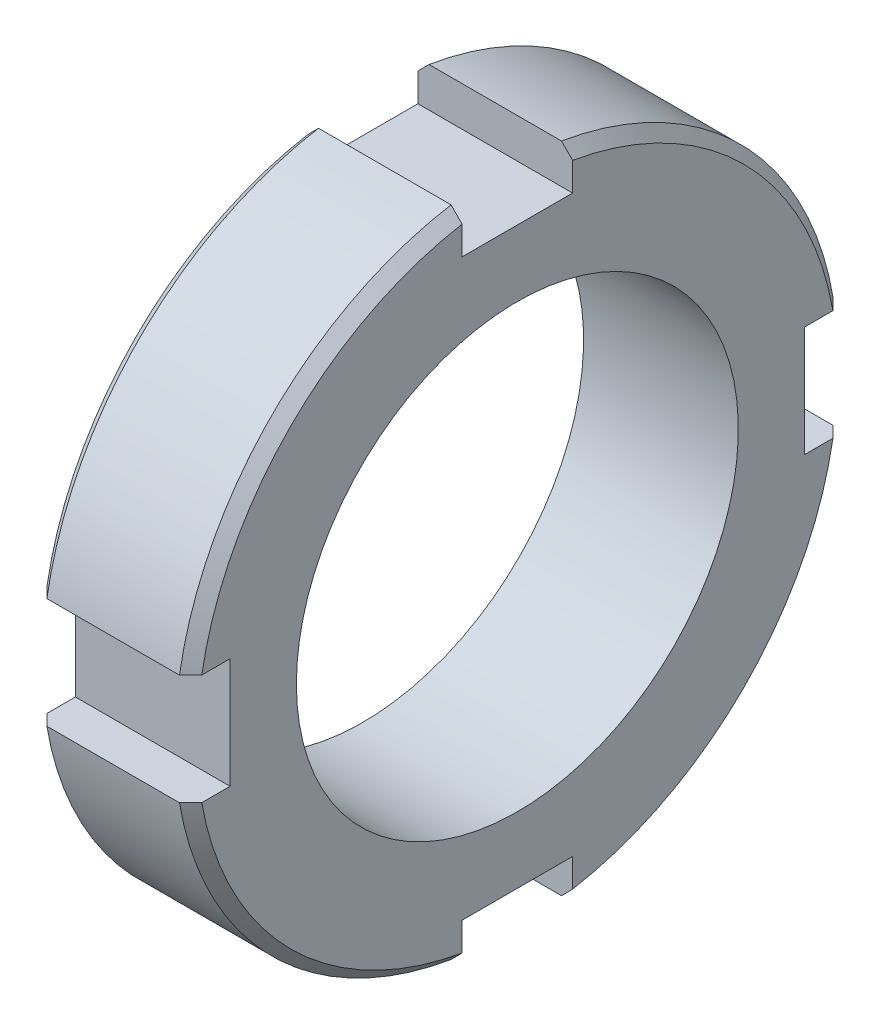
ISO-10303-21;
HEADER;
FILE_DESCRIPTION(('STEP AP214'),'2;1');
FILE_NAME('part.step','',(''),(''),'','','');
FILE_SCHEMA(('AUTOMOTIVE_DESIGN { 1 0 10303 214 1 1 1 1 }'));
ENDSEC;
DATA;
#1=APPLICATION_CONTEXT('core data for automotive mechanical design processes');
#2=APPLICATION_PROTOCOL_DEFINITION('international standard','automotive_design',2000,#1);
#3=PRODUCT_CONTEXT('',#1,'mechanical');
#4=PRODUCT('Part','Part','',(#3));
#5=PRODUCT_RELATED_PRODUCT_CATEGORY('part','',(#4));
#6=PRODUCT_DEFINITION_FORMATION('','',#4);
#7=PRODUCT_DEFINITION_CONTEXT('part definition',#1,'design');
#8=PRODUCT_DEFINITION('design','',#6,#7);
#9=PRODUCT_DEFINITION_SHAPE('','',#8);
#10=(LENGTH_UNIT() NAMED_UNIT(*) SI_UNIT(.MILLI.,.METRE.));
#11=(NAMED_UNIT(*) PLANE_ANGLE_UNIT() SI_UNIT($,.RADIAN.));
#12=(NAMED_UNIT(*) SI_UNIT($,.STERADIAN.) SOLID_ANGLE_UNIT());
#13=UNCERTAINTY_MEASURE_WITH_UNIT(LENGTH_MEASURE(1.E-05),#10,'distance_accuracy_value','');
#14=(GEOMETRIC_REPRESENTATION_CONTEXT(3) GLOBAL_UNCERTAINTY_ASSIGNED_CONTEXT((#13)) GLOBAL_UNIT_ASSIGNED_CONTEXT((#10,
#11,#12)) REPRESENTATION_CONTEXT('',''));
#15=CARTESIAN_POINT('',(0.,0.,0.));
#16=DIRECTION('',(0.,0.,1.));
#17=DIRECTION('',(1.,0.,0.));
#18=AXIS2_PLACEMENT_3D('',#15,#16,#17);
#19=CARTESIAN_POINT('',(0.,10.,0.));
#20=DIRECTION('',(1.,0.,0.));
#21=DIRECTION('',(0.,0.,-1.));
#22=AXIS2_PLACEMENT_3D('',#19,#20,#21);
#23=PLANE('',#22);
#24=CARTESIAN_POINT('',(0.,0.,0.));
#25=DIRECTION('',(-1.,0.,0.));
#26=DIRECTION('',(0.,0.,1.));
#27=AXIS2_PLACEMENT_3D('',#24,#25,#26);
#28=CIRCLE('',#27,10.);
#29=CARTESIAN_POINT('',(0.,0.,10.));
#30=VERTEX_POINT('',#29);
#31=EDGE_CURVE('E211',#30,#30,#28,.T.);
#32=ORIENTED_EDGE('',*,*,#31,.F.);
#33=EDGE_LOOP('',(#32));
#34=FACE_BOUND('',#33,.T.);
#35=DIRECTION('',(0.,0.,1.));
#36=VECTOR('',#35,1.);
#37=CARTESIAN_POINT('',(0.,-2.5,0.));
#38=LINE('',#37,#36);
#39=CARTESIAN_POINT('',(0.,-2.5,-14.2828568570857));
#40=VERTEX_POINT('',#39);
#41=CARTESIAN_POINT('',(0.,-2.5,-13.));
#42=VERTEX_POINT('',#41);
#43=EDGE_CURVE('E258',#40,#42,#38,.T.);
#44=ORIENTED_EDGE('',*,*,#43,.F.);
#45=CARTESIAN_POINT('',(0.,0.,0.));
#46=DIRECTION('',(-1.,0.,0.));
#47=DIRECTION('',(0.,0.,1.));
#48=AXIS2_PLACEMENT_3D('',#45,#46,#47);
#49=CIRCLE('',#48,14.5);
#50=CARTESIAN_POINT('',(0.,-14.2828568570857,-2.5));
#51=VERTEX_POINT('',#50);
#52=EDGE_CURVE('E300',#40,#51,#49,.T.);
#53=ORIENTED_EDGE('',*,*,#52,.T.);
#54=DIRECTION('',(0.,-1.,0.));
#55=VECTOR('',#54,1.);
#56=CARTESIAN_POINT('',(0.,10.,-2.5));
#57=LINE('',#56,#55);
#58=CARTESIAN_POINT('',(0.,-13.,-2.5));
#59=VERTEX_POINT('',#58);
#60=EDGE_CURVE('E504',#59,#51,#57,.T.);
#61=ORIENTED_EDGE('',*,*,#60,.F.);
#62=DIRECTION('',(0.,0.,-1.));
#63=VECTOR('',#62,1.);
#64=CARTESIAN_POINT('',(0.,-13.,0.));
#65=LINE('',#64,#63);
#66=CARTESIAN_POINT('',(0.,-13.,2.5));
#67=VERTEX_POINT('',#66);
#68=EDGE_CURVE('E259',#67,#59,#65,.T.);
#69=ORIENTED_EDGE('',*,*,#68,.F.);
#70=DIRECTION('',(0.,1.,0.));
#71=VECTOR('',#70,1.);
#72=CARTESIAN_POINT('',(0.,10.,2.5));
#73=LINE('',#72,#71);
#74=CARTESIAN_POINT('',(0.,-14.2828568570857,2.5));
#75=VERTEX_POINT('',#74);
#76=EDGE_CURVE('E218',#75,#67,#73,.T.);
#77=ORIENTED_EDGE('',*,*,#76,.F.);
#78=CARTESIAN_POINT('',(0.,-2.5,14.2828568570857));
#79=VERTEX_POINT('',#78);
#80=EDGE_CURVE('E284',#75,#79,#49,.T.);
#81=ORIENTED_EDGE('',*,*,#80,.T.);
#82=DIRECTION('',(0.,0.,1.));
#83=VECTOR('',#82,1.);
#84=CARTESIAN_POINT('',(0.,-2.5,0.));
#85=LINE('',#84,#83);
#86=CARTESIAN_POINT('',(0.,-2.5,13.));
#87=VERTEX_POINT('',#86);
#88=EDGE_CURVE('E316',#87,#79,#85,.T.);
#89=ORIENTED_EDGE('',*,*,#88,.F.);
#90=DIRECTION('',(0.,-1.,0.));
#91=VECTOR('',#90,1.);
#92=CARTESIAN_POINT('',(0.,10.,13.));
#93=LINE('',#92,#91);
#94=CARTESIAN_POINT('',(0.,2.5,13.));
#95=VERTEX_POINT('',#94);
#96=EDGE_CURVE('E359',#95,#87,#93,.T.);
#97=ORIENTED_EDGE('',*,*,#96,.F.);
#98=DIRECTION('',(0.,0.,-1.));
#99=VECTOR('',#98,1.);
#100=CARTESIAN_POINT('',(0.,2.5,0.));
#101=LINE('',#100,#99);
#102=CARTESIAN_POINT('',(0.,2.5,14.2828568570857));
#103=VERTEX_POINT('',#102);
#104=EDGE_CURVE('E541',#103,#95,#101,.T.);
#105=ORIENTED_EDGE('',*,*,#104,.F.);
#106=CARTESIAN_POINT('',(0.,14.2828568570857,2.5));
#107=VERTEX_POINT('',#106);
#108=EDGE_CURVE('E286',#103,#107,#49,.T.);
#109=ORIENTED_EDGE('',*,*,#108,.T.);
#110=DIRECTION('',(0.,1.,0.));
#111=VECTOR('',#110,1.);
#112=CARTESIAN_POINT('',(0.,10.,2.5));
#113=LINE('',#112,#111);
#114=CARTESIAN_POINT('',(0.,13.,2.5));
#115=VERTEX_POINT('',#114);
#116=EDGE_CURVE('E480',#115,#107,#113,.T.);
#117=ORIENTED_EDGE('',*,*,#116,.F.);
#118=DIRECTION('',(0.,0.,1.));
#119=VECTOR('',#118,1.);
#120=CARTESIAN_POINT('',(0.,13.,0.));
#121=LINE('',#120,#119);
#122=CARTESIAN_POINT('',(0.,13.,-2.5));
#123=VERTEX_POINT('',#122);
#124=EDGE_CURVE('E494',#123,#115,#121,.T.);
#125=ORIENTED_EDGE('',*,*,#124,.F.);
#126=DIRECTION('',(0.,-1.,0.));
#127=VECTOR('',#126,1.);
#128=CARTESIAN_POINT('',(0.,10.,-2.5));
#129=LINE('',#128,#127);
#130=CARTESIAN_POINT('',(0.,14.2828568570857,-2.5));
#131=VERTEX_POINT('',#130);
#132=EDGE_CURVE('E549',#131,#123,#129,.T.);
#133=ORIENTED_EDGE('',*,*,#132,.F.);
#134=CARTESIAN_POINT('',(0.,2.5,-14.2828568570857));
#135=VERTEX_POINT('',#134);
#136=EDGE_CURVE('E289',#131,#135,#49,.T.);
#137=ORIENTED_EDGE('',*,*,#136,.T.);
#138=DIRECTION('',(0.,0.,-1.));
#139=VECTOR('',#138,1.);
#140=CARTESIAN_POINT('',(0.,2.5,0.));
#141=LINE('',#140,#139);
#142=CARTESIAN_POINT('',(0.,2.5,-13.));
#143=VERTEX_POINT('',#142);
#144=EDGE_CURVE('E442',#143,#135,#141,.T.);
#145=ORIENTED_EDGE('',*,*,#144,.F.);
#146=DIRECTION('',(0.,1.,0.));
#147=VECTOR('',#146,1.);
#148=CARTESIAN_POINT('',(0.,10.,-13.));
#149=LINE('',#148,#147);
#150=EDGE_CURVE('E302',#42,#143,#149,.T.);
#151=ORIENTED_EDGE('',*,*,#150,.F.);
#152=EDGE_LOOP('',(#44,#53,#61,#69,#77,#81,#89,#97,#105,#109,#117,#125,#133,#137,#145,#151));
#153=FACE_BOUND('',#152,.T.);
#154=ADVANCED_FACE('F39',(#34,#153),#23,.F.);
#155=CARTESIAN_POINT('',(0.5,0.,0.));
#156=DIRECTION('',(1.,0.,0.));
#157=DIRECTION('',(0.,0.,-1.));
#158=AXIS2_PLACEMENT_3D('',#155,#156,#157);
#159=CONICAL_SURFACE('',#158,15.,0.785398163397447);
#160=CARTESIAN_POINT('',(2.56175281280883,-2.5,-16.8776008083314));
#161=CARTESIAN_POINT('',(2.17566157439636,-2.5,-16.4872899597415));
#162=CARTESIAN_POINT('',(1.78970868688512,-2.5,-16.0968421263846));
#163=CARTESIAN_POINT('',(1.01816550457548,-2.5,-15.3155894984025));
#164=CARTESIAN_POINT('',(0.632575209261334,-2.5,-14.9247847042866));
#165=CARTESIAN_POINT('',(-0.138158233958734,-2.5,-14.1427338123163));
#166=CARTESIAN_POINT('',(-0.523301381591013,-2.5,-13.7514877141921));
#167=CARTESIAN_POINT('',(-1.29300160288432,-2.5,-12.9684184128098));
#168=CARTESIAN_POINT('',(-1.67755867570327,-2.5,-12.5765952087241));
#169=CARTESIAN_POINT('',(-2.06175281280883,-2.5,-12.184415992967));
#170=B_SPLINE_CURVE_WITH_KNOTS('',3,(#160,#161,#162,#163,#164,#165,#166,#167,#168,#169),
.UNSPECIFIED.,.F.,.F.,(4,2,2,2,4),(0.,1.64702195842959,3.29404157057531,4.94106219011147,
6.58808517385902),.UNSPECIFIED.);
#171=CARTESIAN_POINT('',(0.5,-2.5,-14.790199457749));
#172=VERTEX_POINT('',#171);
#173=EDGE_CURVE('E303',#172,#40,#170,.T.);
#174=ORIENTED_EDGE('',*,*,#173,.F.);
#175=CARTESIAN_POINT('',(0.5,0.,0.));
#176=DIRECTION('',(-1.,0.,0.));
#177=DIRECTION('',(0.,0.,1.));
#178=AXIS2_PLACEMENT_3D('',#175,#176,#177);
#179=CIRCLE('',#178,15.);
#180=CARTESIAN_POINT('',(0.5,-14.790199457749,-2.5));
#181=VERTEX_POINT('',#180);
#182=EDGE_CURVE('E602',#172,#181,#179,.T.);
#183=ORIENTED_EDGE('',*,*,#182,.T.);
#184=CARTESIAN_POINT('',(-2.06175281280883,-12.184415992967,-2.5));
#185=CARTESIAN_POINT('',(-1.67755867570327,-12.5765952087241,-2.5));
#186=CARTESIAN_POINT('',(-1.29300160288432,-12.9684184128098,-2.5));
#187=CARTESIAN_POINT('',(-0.523301381591013,-13.7514877141921,-2.5));
#188=CARTESIAN_POINT('',(-0.138158233958734,-14.1427338123163,-2.5));
#189=CARTESIAN_POINT('',(0.632575209261334,-14.9247847042866,-2.5));
#190=CARTESIAN_POINT('',(1.01816550457548,-15.3155894984025,-2.5));
#191=CARTESIAN_POINT('',(1.78970868688512,-16.0968421263846,-2.5));
#192=CARTESIAN_POINT('',(2.17566157439636,-16.4872899597415,-2.5));
#193=CARTESIAN_POINT('',(2.56175281280883,-16.8776008083314,-2.5));
#194=B_SPLINE_CURVE_WITH_KNOTS('',3,(#184,#185,#186,#187,#188,#189,#190,#191,#192,#193),
.UNSPECIFIED.,.F.,.F.,(4,2,2,2,4),(0.,1.64702298374755,3.29404360328371,4.94106321542943,
6.58808517385902),.UNSPECIFIED.);
#195=EDGE_CURVE('E310',#51,#181,#194,.T.);
#196=ORIENTED_EDGE('',*,*,#195,.F.);
#197=ORIENTED_EDGE('',*,*,#52,.F.);
#198=EDGE_LOOP('',(#174,#183,#196,#197));
#199=FACE_BOUND('',#198,.T.);
#200=ADVANCED_FACE('F296',(#199),#159,.T.);
#201=CARTESIAN_POINT('',(-2.06175281280883,2.5,-12.184415992967));
#202=CARTESIAN_POINT('',(-1.67755867570327,2.5,-12.5765952087241));
#203=CARTESIAN_POINT('',(-1.29300160288432,2.5,-12.9684184128098));
#204=CARTESIAN_POINT('',(-0.523301381591013,2.5,-13.7514877141921));
#205=CARTESIAN_POINT('',(-0.138158233958734,2.5,-14.1427338123163));
#206=CARTESIAN_POINT('',(0.632575209261334,2.5,-14.9247847042866));
#207=CARTESIAN_POINT('',(1.01816550457548,2.5,-15.3155894984025));
#208=CARTESIAN_POINT('',(1.78970868688512,2.5,-16.0968421263846));
#209=CARTESIAN_POINT('',(2.17566157439636,2.5,-16.4872899597415));
#210=CARTESIAN_POINT('',(2.56175281280883,2.5,-16.8776008083314));
#211=B_SPLINE_CURVE_WITH_KNOTS('',3,(#201,#202,#203,#204,#205,#206,#207,#208,#209,#210),
.UNSPECIFIED.,.F.,.F.,(4,2,2,2,4),(0.,1.64702298374755,3.29404360328371,4.94106321542943,
6.58808517385902),.UNSPECIFIED.);
#212=CARTESIAN_POINT('',(0.5,2.5,-14.790199457749));
#213=VERTEX_POINT('',#212);
#214=EDGE_CURVE('E436',#135,#213,#211,.T.);
#215=ORIENTED_EDGE('',*,*,#214,.F.);
#216=ORIENTED_EDGE('',*,*,#136,.F.);
#217=CARTESIAN_POINT('',(2.56175281280883,16.8776008083314,-2.5));
#218=CARTESIAN_POINT('',(2.17566157439636,16.4872899597415,-2.5));
#219=CARTESIAN_POINT('',(1.78970868688512,16.0968421263846,-2.5));
#220=CARTESIAN_POINT('',(1.01816550457548,15.3155894984025,-2.5));
#221=CARTESIAN_POINT('',(0.632575209261334,14.9247847042866,-2.5));
#222=CARTESIAN_POINT('',(-0.138158233958734,14.1427338123163,-2.5));
#223=CARTESIAN_POINT('',(-0.523301381591013,13.7514877141921,-2.5));
#224=CARTESIAN_POINT('',(-1.29300160288432,12.9684184128098,-2.5));
#225=CARTESIAN_POINT('',(-1.67755867570327,12.5765952087241,-2.5));
#226=CARTESIAN_POINT('',(-2.06175281280883,12.184415992967,-2.5));
#227=B_SPLINE_CURVE_WITH_KNOTS('',3,(#217,#218,#219,#220,#221,#222,#223,#224,#225,#226),
.UNSPECIFIED.,.F.,.F.,(4,2,2,2,4),(0.,1.64702195842959,3.29404157057531,4.94106219011147,
6.58808517385902),.UNSPECIFIED.);
#228=CARTESIAN_POINT('',(0.5,14.790199457749,-2.5));
#229=VERTEX_POINT('',#228);
#230=EDGE_CURVE('E550',#229,#131,#227,.T.);
#231=ORIENTED_EDGE('',*,*,#230,.F.);
#232=EDGE_CURVE('E285',#229,#213,#179,.T.);
#233=ORIENTED_EDGE('',*,*,#232,.T.);
#234=EDGE_LOOP('',(#215,#216,#231,#233));
#235=FACE_BOUND('',#234,.T.);
#236=ADVANCED_FACE('F568',(#235),#159,.T.);
#237=CARTESIAN_POINT('',(-2.06175281280883,-2.5,12.184415992967));
#238=CARTESIAN_POINT('',(-1.67755867570327,-2.5,12.5765952087241));
#239=CARTESIAN_POINT('',(-1.29300160288432,-2.5,12.9684184128098));
#240=CARTESIAN_POINT('',(-0.523301381591013,-2.5,13.7514877141921));
#241=CARTESIAN_POINT('',(-0.138158233958734,-2.5,14.1427338123163));
#242=CARTESIAN_POINT('',(0.632575209261334,-2.5,14.9247847042866));
#243=CARTESIAN_POINT('',(1.01816550457548,-2.5,15.3155894984025));
#244=CARTESIAN_POINT('',(1.78970868688512,-2.5,16.0968421263846));
#245=CARTESIAN_POINT('',(2.17566157439636,-2.5,16.4872899597415));
#246=CARTESIAN_POINT('',(2.56175281280883,-2.5,16.8776008083314));
#247=B_SPLINE_CURVE_WITH_KNOTS('',3,(#237,#238,#239,#240,#241,#242,#243,#244,#245,#246),
.UNSPECIFIED.,.F.,.F.,(4,2,2,2,4),(0.,1.64702298374755,3.29404360328371,4.94106321542943,
6.58808517385902),.UNSPECIFIED.);
#248=CARTESIAN_POINT('',(0.5,-2.5,14.790199457749));
#249=VERTEX_POINT('',#248);
#250=EDGE_CURVE('E324',#79,#249,#247,.T.);
#251=ORIENTED_EDGE('',*,*,#250,.F.);
#252=ORIENTED_EDGE('',*,*,#80,.F.);
#253=CARTESIAN_POINT('',(2.56175281280883,-16.8776008083314,2.5));
#254=CARTESIAN_POINT('',(2.17566157439636,-16.4872899597415,2.5));
#255=CARTESIAN_POINT('',(1.78970868688512,-16.0968421263846,2.5));
#256=CARTESIAN_POINT('',(1.01816550457548,-15.3155894984025,2.5));
#257=CARTESIAN_POINT('',(0.632575209261334,-14.9247847042866,2.5));
#258=CARTESIAN_POINT('',(-0.138158233958734,-14.1427338123163,2.5));
#259=CARTESIAN_POINT('',(-0.523301381591013,-13.7514877141921,2.5));
#260=CARTESIAN_POINT('',(-1.29300160288432,-12.9684184128098,2.5));
#261=CARTESIAN_POINT('',(-1.67755867570327,-12.5765952087241,2.5));
#262=CARTESIAN_POINT('',(-2.06175281280883,-12.184415992967,2.5));
#263=B_SPLINE_CURVE_WITH_KNOTS('',3,(#253,#254,#255,#256,#257,#258,#259,#260,#261,#262),
.UNSPECIFIED.,.F.,.F.,(4,2,2,2,4),(0.,1.64702195842959,3.29404157057531,4.94106219011147,
6.58808517385902),.UNSPECIFIED.);
#264=CARTESIAN_POINT('',(0.5,-14.790199457749,2.5));
#265=VERTEX_POINT('',#264);
#266=EDGE_CURVE('E322',#265,#75,#263,.T.);
#267=ORIENTED_EDGE('',*,*,#266,.F.);
#268=EDGE_CURVE('E279',#265,#249,#179,.T.);
#269=ORIENTED_EDGE('',*,*,#268,.T.);
#270=EDGE_LOOP('',(#251,#252,#267,#269));
#271=FACE_BOUND('',#270,.T.);
#272=ADVANCED_FACE('F320',(#271),#159,.T.);
#273=CARTESIAN_POINT('',(2.56175281280883,2.5,16.8776008083314));
#274=CARTESIAN_POINT('',(2.17566157439636,2.5,16.4872899597415));
#275=CARTESIAN_POINT('',(1.78970868688512,2.5,16.0968421263846));
#276=CARTESIAN_POINT('',(1.01816550457548,2.5,15.3155894984025));
#277=CARTESIAN_POINT('',(0.632575209261334,2.5,14.9247847042866));
#278=CARTESIAN_POINT('',(-0.138158233958734,2.5,14.1427338123163));
#279=CARTESIAN_POINT('',(-0.523301381591013,2.5,13.7514877141921));
#280=CARTESIAN_POINT('',(-1.29300160288432,2.5,12.9684184128098));
#281=CARTESIAN_POINT('',(-1.67755867570327,2.5,12.5765952087241));
#282=CARTESIAN_POINT('',(-2.06175281280883,2.5,12.184415992967));
#283=B_SPLINE_CURVE_WITH_KNOTS('',3,(#273,#274,#275,#276,#277,#278,#279,#280,#281,#282),
.UNSPECIFIED.,.F.,.F.,(4,2,2,2,4),(0.,1.64702195842959,3.29404157057531,4.94106219011147,
6.58808517385902),.UNSPECIFIED.);
#284=CARTESIAN_POINT('',(0.5,2.5,14.790199457749));
#285=VERTEX_POINT('',#284);
#286=EDGE_CURVE('E542',#285,#103,#283,.T.);
#287=ORIENTED_EDGE('',*,*,#286,.F.);
#288=CARTESIAN_POINT('',(0.5,14.790199457749,2.5));
#289=VERTEX_POINT('',#288);
#290=EDGE_CURVE('E281',#285,#289,#179,.T.);
#291=ORIENTED_EDGE('',*,*,#290,.T.);
#292=CARTESIAN_POINT('',(-2.06175281280883,12.184415992967,2.5));
#293=CARTESIAN_POINT('',(-1.67755867570327,12.5765952087241,2.5));
#294=CARTESIAN_POINT('',(-1.29300160288432,12.9684184128098,2.5));
#295=CARTESIAN_POINT('',(-0.523301381591013,13.7514877141921,2.5));
#296=CARTESIAN_POINT('',(-0.138158233958734,14.1427338123163,2.5));
#297=CARTESIAN_POINT('',(0.632575209261334,14.9247847042866,2.5));
#298=CARTESIAN_POINT('',(1.01816550457548,15.3155894984025,2.5));
#299=CARTESIAN_POINT('',(1.78970868688512,16.0968421263846,2.5));
#300=CARTESIAN_POINT('',(2.17566157439636,16.4872899597415,2.5));
#301=CARTESIAN_POINT('',(2.56175281280883,16.8776008083314,2.5));
#302=B_SPLINE_CURVE_WITH_KNOTS('',3,(#292,#293,#294,#295,#296,#297,#298,#299,#300,#301),
.UNSPECIFIED.,.F.,.F.,(4,2,2,2,4),(0.,1.64702298374755,3.29404360328371,4.94106321542943,
6.58808517385902),.UNSPECIFIED.);
#303=EDGE_CURVE('E527',#107,#289,#302,.T.);
#304=ORIENTED_EDGE('',*,*,#303,.F.);
#305=ORIENTED_EDGE('',*,*,#108,.F.);
#306=EDGE_LOOP('',(#287,#291,#304,#305));
#307=FACE_BOUND('',#306,.T.);
#308=ADVANCED_FACE('F538',(#307),#159,.T.);
#309=CARTESIAN_POINT('',(-5.,0.,0.));
#310=DIRECTION('',(-1.,0.,0.));
#311=DIRECTION('',(0.,0.,1.));
#312=AXIS2_PLACEMENT_3D('',#309,#310,#311);
#313=CYLINDRICAL_SURFACE('',#312,15.);
#314=DIRECTION('',(-1.,0.,0.));
#315=VECTOR('',#314,1.);
#316=CARTESIAN_POINT('',(-5.,-2.5,-14.790199457749));
#317=LINE('',#316,#315);
#318=CARTESIAN_POINT('',(6.5,-2.5,-14.790199457749));
#319=VERTEX_POINT('',#318);
#320=EDGE_CURVE('E449',#319,#172,#317,.T.);
#321=ORIENTED_EDGE('',*,*,#320,.F.);
#322=CARTESIAN_POINT('',(6.5,0.,0.));
#323=DIRECTION('',(-1.,0.,0.));
#324=DIRECTION('',(0.,0.,1.));
#325=AXIS2_PLACEMENT_3D('',#322,#323,#324);
#326=CIRCLE('',#325,15.);
#327=CARTESIAN_POINT('',(6.5,-14.790199457749,-2.5));
#328=VERTEX_POINT('',#327);
#329=EDGE_CURVE('E580',#319,#328,#326,.T.);
#330=ORIENTED_EDGE('',*,*,#329,.T.);
#331=DIRECTION('',(-1.,0.,0.));
#332=VECTOR('',#331,1.);
#333=CARTESIAN_POINT('',(-5.,-14.790199457749,-2.5));
#334=LINE('',#333,#332);
#335=EDGE_CURVE('E501',#181,#328,#334,.F.);
#336=ORIENTED_EDGE('',*,*,#335,.F.);
#337=ORIENTED_EDGE('',*,*,#182,.F.);
#338=EDGE_LOOP('',(#321,#330,#336,#337));
#339=FACE_BOUND('',#338,.T.);
#340=ADVANCED_FACE('F369',(#339),#313,.T.);
#341=DIRECTION('',(-1.,0.,0.));
#342=VECTOR('',#341,1.);
#343=CARTESIAN_POINT('',(-5.,2.5,-14.790199457749));
#344=LINE('',#343,#342);
#345=CARTESIAN_POINT('',(6.5,2.5,-14.790199457749));
#346=VERTEX_POINT('',#345);
#347=EDGE_CURVE('E428',#213,#346,#344,.F.);
#348=ORIENTED_EDGE('',*,*,#347,.F.);
#349=ORIENTED_EDGE('',*,*,#232,.F.);
#350=DIRECTION('',(-1.,0.,0.));
#351=VECTOR('',#350,1.);
#352=CARTESIAN_POINT('',(-5.,14.790199457749,-2.5));
#353=LINE('',#352,#351);
#354=CARTESIAN_POINT('',(6.5,14.790199457749,-2.5));
#355=VERTEX_POINT('',#354);
#356=EDGE_CURVE('E557',#355,#229,#353,.T.);
#357=ORIENTED_EDGE('',*,*,#356,.F.);
#358=EDGE_CURVE('E280',#355,#346,#326,.T.);
#359=ORIENTED_EDGE('',*,*,#358,.T.);
#360=EDGE_LOOP('',(#348,#349,#357,#359));
#361=FACE_BOUND('',#360,.T.);
#362=ADVANCED_FACE('F575',(#361),#313,.T.);
#363=DIRECTION('',(-1.,0.,0.));
#364=VECTOR('',#363,1.);
#365=CARTESIAN_POINT('',(-5.,-2.5,14.790199457749));
#366=LINE('',#365,#364);
#367=CARTESIAN_POINT('',(6.5,-2.5,14.790199457749));
#368=VERTEX_POINT('',#367);
#369=EDGE_CURVE('E327',#249,#368,#366,.F.);
#370=ORIENTED_EDGE('',*,*,#369,.F.);
#371=ORIENTED_EDGE('',*,*,#268,.F.);
#372=DIRECTION('',(-1.,0.,0.));
#373=VECTOR('',#372,1.);
#374=CARTESIAN_POINT('',(-5.,-14.790199457749,2.5));
#375=LINE('',#374,#373);
#376=CARTESIAN_POINT('',(6.5,-14.790199457749,2.5));
#377=VERTEX_POINT('',#376);
#378=EDGE_CURVE('E590',#377,#265,#375,.T.);
#379=ORIENTED_EDGE('',*,*,#378,.F.);
#380=EDGE_CURVE('E274',#377,#368,#326,.T.);
#381=ORIENTED_EDGE('',*,*,#380,.T.);
#382=EDGE_LOOP('',(#370,#371,#379,#381));
#383=FACE_BOUND('',#382,.T.);
#384=ADVANCED_FACE('F589',(#383),#313,.T.);
#385=DIRECTION('',(-1.,0.,0.));
#386=VECTOR('',#385,1.);
#387=CARTESIAN_POINT('',(-5.,2.5,14.790199457749));
#388=LINE('',#387,#386);
#389=CARTESIAN_POINT('',(6.5,2.5,14.790199457749));
#390=VERTEX_POINT('',#389);
#391=EDGE_CURVE('E479',#390,#285,#388,.T.);
#392=ORIENTED_EDGE('',*,*,#391,.F.);
#393=CARTESIAN_POINT('',(6.5,14.790199457749,2.5));
#394=VERTEX_POINT('',#393);
#395=EDGE_CURVE('E276',#390,#394,#326,.T.);
#396=ORIENTED_EDGE('',*,*,#395,.T.);
#397=DIRECTION('',(-1.,0.,0.));
#398=VECTOR('',#397,1.);
#399=CARTESIAN_POINT('',(-5.,14.790199457749,2.5));
#400=LINE('',#399,#398);
#401=EDGE_CURVE('E532',#289,#394,#400,.F.);
#402=ORIENTED_EDGE('',*,*,#401,.F.);
#403=ORIENTED_EDGE('',*,*,#290,.F.);
#404=EDGE_LOOP('',(#392,#396,#402,#403));
#405=FACE_BOUND('',#404,.T.);
#406=ADVANCED_FACE('F366',(#405),#313,.T.);
#407=CARTESIAN_POINT('',(7.,0.,0.));
#408=DIRECTION('',(-1.,0.,0.));
#409=DIRECTION('',(0.,0.,1.));
#410=AXIS2_PLACEMENT_3D('',#407,#408,#409);
#411=CONICAL_SURFACE('',#410,14.5,0.785398163397447);
#412=CARTESIAN_POINT('',(9.06175281280883,-2.5,-12.184415992967));
#413=CARTESIAN_POINT('',(8.67755867570327,-2.5,-12.5765952087241));
#414=CARTESIAN_POINT('',(8.29300160288432,-2.5,-12.9684184128098));
#415=CARTESIAN_POINT('',(7.52330138159102,-2.5,-13.7514877141921));
#416=CARTESIAN_POINT('',(7.13815823395874,-2.5,-14.1427338123163));
#417=CARTESIAN_POINT('',(6.36742479073867,-2.5,-14.9247847042866));
#418=CARTESIAN_POINT('',(5.98183449542452,-2.5,-15.3155894984025));
#419=CARTESIAN_POINT('',(5.21029131311488,-2.5,-16.0968421263846));
#420=CARTESIAN_POINT('',(4.82433842560365,-2.5,-16.4872899597415));
#421=CARTESIAN_POINT('',(4.43824718719117,-2.5,-16.8776008083314));
#422=B_SPLINE_CURVE_WITH_KNOTS('',3,(#412,#413,#414,#415,#416,#417,#418,#419,#420,#421),
.UNSPECIFIED.,.F.,.F.,(4,2,2,2,4),(0.,1.64702298374755,3.2940436032837,4.94106321542943,
6.58808517385902),.UNSPECIFIED.);
#423=CARTESIAN_POINT('',(7.,-2.5,-14.2828568570857));
#424=VERTEX_POINT('',#423);
#425=EDGE_CURVE('E443',#424,#319,#422,.T.);
#426=ORIENTED_EDGE('',*,*,#425,.F.);
#427=CARTESIAN_POINT('',(7.,0.,0.));
#428=DIRECTION('',(-1.,0.,0.));
#429=DIRECTION('',(0.,0.,1.));
#430=AXIS2_PLACEMENT_3D('',#427,#428,#429);
#431=CIRCLE('',#430,14.5);
#432=CARTESIAN_POINT('',(7.,-14.2828568570857,-2.5));
#433=VERTEX_POINT('',#432);
#434=EDGE_CURVE('E263',#424,#433,#431,.T.);
#435=ORIENTED_EDGE('',*,*,#434,.T.);
#436=CARTESIAN_POINT('',(4.43824718719117,-16.8776008083314,-2.5));
#437=CARTESIAN_POINT('',(4.82433842560365,-16.4872899597415,-2.5));
#438=CARTESIAN_POINT('',(5.21029131311488,-16.0968421263846,-2.5));
#439=CARTESIAN_POINT('',(5.98183449542452,-15.3155894984025,-2.5));
#440=CARTESIAN_POINT('',(6.36742479073867,-14.9247847042866,-2.5));
#441=CARTESIAN_POINT('',(7.13815823395874,-14.1427338123163,-2.5));
#442=CARTESIAN_POINT('',(7.52330138159102,-13.7514877141921,-2.5));
#443=CARTESIAN_POINT('',(8.29300160288432,-12.9684184128098,-2.5));
#444=CARTESIAN_POINT('',(8.67755867570327,-12.5765952087241,-2.5));
#445=CARTESIAN_POINT('',(9.06175281280883,-12.184415992967,-2.5));
#446=B_SPLINE_CURVE_WITH_KNOTS('',3,(#436,#437,#438,#439,#440,#441,#442,#443,#444,#445),
.UNSPECIFIED.,.F.,.F.,(4,2,2,2,4),(0.,1.64702195842959,3.29404157057531,4.94106219011147,
6.58808517385902),.UNSPECIFIED.);
#447=EDGE_CURVE('E373',#328,#433,#446,.T.);
#448=ORIENTED_EDGE('',*,*,#447,.F.);
#449=ORIENTED_EDGE('',*,*,#329,.F.);
#450=EDGE_LOOP('',(#426,#435,#448,#449));
#451=FACE_BOUND('',#450,.T.);
#452=ADVANCED_FACE('F361',(#451),#411,.T.);
#453=CARTESIAN_POINT('',(4.43824718719117,2.5,-16.8776008083314));
#454=CARTESIAN_POINT('',(4.82433842560365,2.5,-16.4872899597415));
#455=CARTESIAN_POINT('',(5.21029131311488,2.5,-16.0968421263846));
#456=CARTESIAN_POINT('',(5.98183449542452,2.5,-15.3155894984025));
#457=CARTESIAN_POINT('',(6.36742479073867,2.5,-14.9247847042866));
#458=CARTESIAN_POINT('',(7.13815823395874,2.5,-14.1427338123163));
#459=CARTESIAN_POINT('',(7.52330138159102,2.5,-13.7514877141921));
#460=CARTESIAN_POINT('',(8.29300160288432,2.5,-12.9684184128098));
#461=CARTESIAN_POINT('',(8.67755867570327,2.5,-12.5765952087241));
#462=CARTESIAN_POINT('',(9.06175281280883,2.5,-12.184415992967));
#463=B_SPLINE_CURVE_WITH_KNOTS('',3,(#453,#454,#455,#456,#457,#458,#459,#460,#461,#462),
.UNSPECIFIED.,.F.,.F.,(4,2,2,2,4),(0.,1.64702195842959,3.29404157057531,4.94106219011147,
6.58808517385902),.UNSPECIFIED.);
#464=CARTESIAN_POINT('',(7.,2.5,-14.2828568570857));
#465=VERTEX_POINT('',#464);
#466=EDGE_CURVE('E329',#346,#465,#463,.T.);
#467=ORIENTED_EDGE('',*,*,#466,.F.);
#468=ORIENTED_EDGE('',*,*,#358,.F.);
#469=CARTESIAN_POINT('',(9.06175281280883,12.184415992967,-2.5));
#470=CARTESIAN_POINT('',(8.67755867570327,12.5765952087241,-2.5));
#471=CARTESIAN_POINT('',(8.29300160288432,12.9684184128098,-2.5));
#472=CARTESIAN_POINT('',(7.52330138159102,13.7514877141921,-2.5));
#473=CARTESIAN_POINT('',(7.13815823395874,14.1427338123163,-2.5));
#474=CARTESIAN_POINT('',(6.36742479073867,14.9247847042866,-2.5));
#475=CARTESIAN_POINT('',(5.98183449542452,15.3155894984025,-2.5));
#476=CARTESIAN_POINT('',(5.21029131311488,16.0968421263846,-2.5));
#477=CARTESIAN_POINT('',(4.82433842560365,16.4872899597415,-2.5));
#478=CARTESIAN_POINT('',(4.43824718719117,16.8776008083314,-2.5));
#479=B_SPLINE_CURVE_WITH_KNOTS('',3,(#469,#470,#471,#472,#473,#474,#475,#476,#477,#478),
.UNSPECIFIED.,.F.,.F.,(4,2,2,2,4),(0.,1.64702298374755,3.2940436032837,4.94106321542943,
6.58808517385902),.UNSPECIFIED.);
#480=CARTESIAN_POINT('',(7.,14.2828568570857,-2.5));
#481=VERTEX_POINT('',#480);
#482=EDGE_CURVE('E395',#481,#355,#479,.T.);
#483=ORIENTED_EDGE('',*,*,#482,.F.);
#484=EDGE_CURVE('E266',#481,#465,#431,.T.);
#485=ORIENTED_EDGE('',*,*,#484,.T.);
#486=EDGE_LOOP('',(#467,#468,#483,#485));
#487=FACE_BOUND('',#486,.T.);
#488=ADVANCED_FACE('F365',(#487),#411,.T.);
#489=CARTESIAN_POINT('',(4.43824718719117,-2.5,16.8776008083314));
#490=CARTESIAN_POINT('',(4.82433842560365,-2.5,16.4872899597415));
#491=CARTESIAN_POINT('',(5.21029131311488,-2.5,16.0968421263846));
#492=CARTESIAN_POINT('',(5.98183449542452,-2.5,15.3155894984025));
#493=CARTESIAN_POINT('',(6.36742479073867,-2.5,14.9247847042866));
#494=CARTESIAN_POINT('',(7.13815823395874,-2.5,14.1427338123163));
#495=CARTESIAN_POINT('',(7.52330138159102,-2.5,13.7514877141921));
#496=CARTESIAN_POINT('',(8.29300160288432,-2.5,12.9684184128098));
#497=CARTESIAN_POINT('',(8.67755867570327,-2.5,12.5765952087241));
#498=CARTESIAN_POINT('',(9.06175281280883,-2.5,12.184415992967));
#499=B_SPLINE_CURVE_WITH_KNOTS('',3,(#489,#490,#491,#492,#493,#494,#495,#496,#497,#498),
.UNSPECIFIED.,.F.,.F.,(4,2,2,2,4),(0.,1.64702195842959,3.29404157057531,4.94106219011147,
6.58808517385902),.UNSPECIFIED.);
#500=CARTESIAN_POINT('',(7.,-2.5,14.2828568570857));
#501=VERTEX_POINT('',#500);
#502=EDGE_CURVE('E331',#368,#501,#499,.T.);
#503=ORIENTED_EDGE('',*,*,#502,.F.);
#504=ORIENTED_EDGE('',*,*,#380,.F.);
#505=CARTESIAN_POINT('',(9.06175281280883,-12.184415992967,2.5));
#506=CARTESIAN_POINT('',(8.67755867570327,-12.5765952087241,2.5));
#507=CARTESIAN_POINT('',(8.29300160288432,-12.9684184128098,2.5));
#508=CARTESIAN_POINT('',(7.52330138159102,-13.7514877141921,2.5));
#509=CARTESIAN_POINT('',(7.13815823395874,-14.1427338123163,2.5));
#510=CARTESIAN_POINT('',(6.36742479073867,-14.9247847042866,2.5));
#511=CARTESIAN_POINT('',(5.98183449542452,-15.3155894984025,2.5));
#512=CARTESIAN_POINT('',(5.21029131311488,-16.0968421263846,2.5));
#513=CARTESIAN_POINT('',(4.82433842560365,-16.4872899597415,2.5));
#514=CARTESIAN_POINT('',(4.43824718719117,-16.8776008083314,2.5));
#515=B_SPLINE_CURVE_WITH_KNOTS('',3,(#505,#506,#507,#508,#509,#510,#511,#512,#513,#514),
.UNSPECIFIED.,.F.,.F.,(4,2,2,2,4),(0.,1.64702298374755,3.2940436032837,4.94106321542943,
6.58808517385902),.UNSPECIFIED.);
#516=CARTESIAN_POINT('',(7.,-14.2828568570857,2.5));
#517=VERTEX_POINT('',#516);
#518=EDGE_CURVE('E385',#517,#377,#515,.T.);
#519=ORIENTED_EDGE('',*,*,#518,.F.);
#520=EDGE_CURVE('E226',#517,#501,#431,.T.);
#521=ORIENTED_EDGE('',*,*,#520,.T.);
#522=EDGE_LOOP('',(#503,#504,#519,#521));
#523=FACE_BOUND('',#522,.T.);
#524=ADVANCED_FACE('F468',(#523),#411,.T.);
#525=CARTESIAN_POINT('',(9.06175281280883,2.5,12.184415992967));
#526=CARTESIAN_POINT('',(8.67755867570327,2.5,12.5765952087241));
#527=CARTESIAN_POINT('',(8.29300160288432,2.5,12.9684184128098));
#528=CARTESIAN_POINT('',(7.52330138159102,2.5,13.7514877141921));
#529=CARTESIAN_POINT('',(7.13815823395874,2.5,14.1427338123163));
#530=CARTESIAN_POINT('',(6.36742479073867,2.5,14.9247847042866));
#531=CARTESIAN_POINT('',(5.98183449542452,2.5,15.3155894984025));
#532=CARTESIAN_POINT('',(5.21029131311488,2.5,16.0968421263846));
#533=CARTESIAN_POINT('',(4.82433842560365,2.5,16.4872899597415));
#534=CARTESIAN_POINT('',(4.43824718719117,2.5,16.8776008083314));
#535=B_SPLINE_CURVE_WITH_KNOTS('',3,(#525,#526,#527,#528,#529,#530,#531,#532,#533,#534),
.UNSPECIFIED.,.F.,.F.,(4,2,2,2,4),(0.,1.64702298374755,3.2940436032837,4.94106321542943,
6.58808517385902),.UNSPECIFIED.);
#536=CARTESIAN_POINT('',(7.,2.5,14.2828568570857));
#537=VERTEX_POINT('',#536);
#538=EDGE_CURVE('E415',#537,#390,#535,.T.);
#539=ORIENTED_EDGE('',*,*,#538,.F.);
#540=CARTESIAN_POINT('',(7.,14.2828568570857,2.5));
#541=VERTEX_POINT('',#540);
#542=EDGE_CURVE('E269',#537,#541,#431,.T.);
#543=ORIENTED_EDGE('',*,*,#542,.T.);
#544=CARTESIAN_POINT('',(4.43824718719117,16.8776008083314,2.5));
#545=CARTESIAN_POINT('',(4.82433842560365,16.4872899597415,2.5));
#546=CARTESIAN_POINT('',(5.21029131311488,16.0968421263846,2.5));
#547=CARTESIAN_POINT('',(5.98183449542452,15.3155894984025,2.5));
#548=CARTESIAN_POINT('',(6.36742479073867,14.9247847042866,2.5));
#549=CARTESIAN_POINT('',(7.13815823395874,14.1427338123163,2.5));
#550=CARTESIAN_POINT('',(7.52330138159102,13.7514877141921,2.5));
#551=CARTESIAN_POINT('',(8.29300160288432,12.9684184128098,2.5));
#552=CARTESIAN_POINT('',(8.67755867570327,12.5765952087241,2.5));
#553=CARTESIAN_POINT('',(9.06175281280883,12.184415992967,2.5));
#554=B_SPLINE_CURVE_WITH_KNOTS('',3,(#544,#545,#546,#547,#548,#549,#550,#551,#552,#553),
.UNSPECIFIED.,.F.,.F.,(4,2,2,2,4),(0.,1.64702195842959,3.29404157057531,4.94106219011147,
6.58808517385902),.UNSPECIFIED.);
#555=EDGE_CURVE('E405',#394,#541,#554,.T.);
#556=ORIENTED_EDGE('',*,*,#555,.F.);
#557=ORIENTED_EDGE('',*,*,#395,.F.);
#558=EDGE_LOOP('',(#539,#543,#556,#557));
#559=FACE_BOUND('',#558,.T.);
#560=ADVANCED_FACE('F367',(#559),#411,.T.);
#561=CARTESIAN_POINT('',(7.,14.5,0.));
#562=DIRECTION('',(-1.,0.,0.));
#563=DIRECTION('',(0.,0.,1.));
#564=AXIS2_PLACEMENT_3D('',#561,#562,#563);
#565=PLANE('',#564);
#566=CARTESIAN_POINT('',(7.,0.,0.));
#567=DIRECTION('',(-1.,0.,0.));
#568=DIRECTION('',(0.,0.,1.));
#569=AXIS2_PLACEMENT_3D('',#566,#567,#568);
#570=CIRCLE('',#569,10.);
#571=CARTESIAN_POINT('',(7.,0.,10.));
#572=VERTEX_POINT('',#571);
#573=EDGE_CURVE('E270',#572,#572,#570,.T.);
#574=ORIENTED_EDGE('',*,*,#573,.T.);
#575=EDGE_LOOP('',(#574));
#576=FACE_BOUND('',#575,.T.);
#577=DIRECTION('',(0.,0.,-1.));
#578=VECTOR('',#577,1.);
#579=CARTESIAN_POINT('',(7.,-2.5,0.));
#580=LINE('',#579,#578);
#581=CARTESIAN_POINT('',(7.,-2.5,-13.));
#582=VERTEX_POINT('',#581);
#583=EDGE_CURVE('E11',#582,#424,#580,.T.);
#584=ORIENTED_EDGE('',*,*,#583,.F.);
#585=DIRECTION('',(0.,-1.,0.));
#586=VECTOR('',#585,1.);
#587=CARTESIAN_POINT('',(7.,14.5,-13.));
#588=LINE('',#587,#586);
#589=CARTESIAN_POINT('',(7.,2.5,-13.));
#590=VERTEX_POINT('',#589);
#591=EDGE_CURVE('E47',#590,#582,#588,.T.);
#592=ORIENTED_EDGE('',*,*,#591,.F.);
#593=DIRECTION('',(0.,0.,1.));
#594=VECTOR('',#593,1.);
#595=CARTESIAN_POINT('',(7.,2.5,0.));
#596=LINE('',#595,#594);
#597=EDGE_CURVE('E242',#465,#590,#596,.T.);
#598=ORIENTED_EDGE('',*,*,#597,.F.);
#599=ORIENTED_EDGE('',*,*,#484,.F.);
#600=DIRECTION('',(0.,1.,0.));
#601=VECTOR('',#600,1.);
#602=CARTESIAN_POINT('',(7.,14.5,-2.5));
#603=LINE('',#602,#601);
#604=CARTESIAN_POINT('',(7.,13.,-2.5));
#605=VERTEX_POINT('',#604);
#606=EDGE_CURVE('E227',#605,#481,#603,.T.);
#607=ORIENTED_EDGE('',*,*,#606,.F.);
#608=DIRECTION('',(0.,0.,-1.));
#609=VECTOR('',#608,1.);
#610=CARTESIAN_POINT('',(7.,13.,0.));
#611=LINE('',#610,#609);
#612=CARTESIAN_POINT('',(7.,13.,2.5));
#613=VERTEX_POINT('',#612);
#614=EDGE_CURVE('E229',#613,#605,#611,.T.);
#615=ORIENTED_EDGE('',*,*,#614,.F.);
#616=DIRECTION('',(0.,-1.,0.));
#617=VECTOR('',#616,1.);
#618=CARTESIAN_POINT('',(7.,14.5,2.5));
#619=LINE('',#618,#617);
#620=EDGE_CURVE('E234',#541,#613,#619,.T.);
#621=ORIENTED_EDGE('',*,*,#620,.F.);
#622=ORIENTED_EDGE('',*,*,#542,.F.);
#623=DIRECTION('',(0.,0.,1.));
#624=VECTOR('',#623,1.);
#625=CARTESIAN_POINT('',(7.,2.5,0.));
#626=LINE('',#625,#624);
#627=CARTESIAN_POINT('',(7.,2.5,13.));
#628=VERTEX_POINT('',#627);
#629=EDGE_CURVE('E236',#628,#537,#626,.T.);
#630=ORIENTED_EDGE('',*,*,#629,.F.);
#631=DIRECTION('',(0.,1.,0.));
#632=VECTOR('',#631,1.);
#633=CARTESIAN_POINT('',(7.,14.5,13.));
#634=LINE('',#633,#632);
#635=CARTESIAN_POINT('',(7.,-2.5,13.));
#636=VERTEX_POINT('',#635);
#637=EDGE_CURVE('E238',#636,#628,#634,.T.);
#638=ORIENTED_EDGE('',*,*,#637,.F.);
#639=DIRECTION('',(0.,0.,-1.));
#640=VECTOR('',#639,1.);
#641=CARTESIAN_POINT('',(7.,-2.5,0.));
#642=LINE('',#641,#640);
#643=EDGE_CURVE('E240',#501,#636,#642,.T.);
#644=ORIENTED_EDGE('',*,*,#643,.F.);
#645=ORIENTED_EDGE('',*,*,#520,.F.);
#646=DIRECTION('',(0.,-1.,0.));
#647=VECTOR('',#646,1.);
#648=CARTESIAN_POINT('',(7.,14.5,2.5));
#649=LINE('',#648,#647);
#650=CARTESIAN_POINT('',(7.,-13.,2.5));
#651=VERTEX_POINT('',#650);
#652=EDGE_CURVE('E215',#651,#517,#649,.T.);
#653=ORIENTED_EDGE('',*,*,#652,.F.);
#654=DIRECTION('',(0.,0.,1.));
#655=VECTOR('',#654,1.);
#656=CARTESIAN_POINT('',(7.,-13.,0.));
#657=LINE('',#656,#655);
#658=CARTESIAN_POINT('',(7.,-13.,-2.5));
#659=VERTEX_POINT('',#658);
#660=EDGE_CURVE('E199',#659,#651,#657,.T.);
#661=ORIENTED_EDGE('',*,*,#660,.F.);
#662=DIRECTION('',(0.,1.,0.));
#663=VECTOR('',#662,1.);
#664=CARTESIAN_POINT('',(7.,14.5,-2.5));
#665=LINE('',#664,#663);
#666=EDGE_CURVE('E210',#433,#659,#665,.T.);
#667=ORIENTED_EDGE('',*,*,#666,.F.);
#668=ORIENTED_EDGE('',*,*,#434,.F.);
#669=EDGE_LOOP('',(#584,#592,#598,#599,#607,#615,#621,#622,#630,#638,#644,#645,#653,#661,#667,#668));
#670=FACE_BOUND('',#669,.T.);
#671=ADVANCED_FACE('F223',(#576,#670),#565,.F.);
#672=CARTESIAN_POINT('',(-5.,0.,0.));
#673=DIRECTION('',(-1.,0.,0.));
#674=DIRECTION('',(0.,0.,1.));
#675=AXIS2_PLACEMENT_3D('',#672,#673,#674);
#676=CYLINDRICAL_SURFACE('',#675,10.);
#677=ORIENTED_EDGE('',*,*,#573,.F.);
#678=EDGE_LOOP('',(#677));
#679=FACE_BOUND('',#678,.T.);
#680=ORIENTED_EDGE('',*,*,#31,.T.);
#681=EDGE_LOOP('',(#680));
#682=FACE_BOUND('',#681,.T.);
#683=ADVANCED_FACE('F41',(#679,#682),#676,.F.);
#684=CARTESIAN_POINT('',(7.5,-13.,2.5));
#685=DIRECTION('',(0.,0.,-1.));
#686=DIRECTION('',(-1.,0.,0.));
#687=AXIS2_PLACEMENT_3D('',#684,#685,#686);
#688=PLANE('',#687);
#689=ORIENTED_EDGE('',*,*,#76,.T.);
#690=DIRECTION('',(-1.,0.,0.));
#691=VECTOR('',#690,1.);
#692=CARTESIAN_POINT('',(7.5,-13.,2.5));
#693=LINE('',#692,#691);
#694=EDGE_CURVE('E202',#651,#67,#693,.T.);
#695=ORIENTED_EDGE('',*,*,#694,.F.);
#696=ORIENTED_EDGE('',*,*,#652,.T.);
#697=ORIENTED_EDGE('',*,*,#518,.T.);
#698=ORIENTED_EDGE('',*,*,#378,.T.);
#699=ORIENTED_EDGE('',*,*,#266,.T.);
#700=EDGE_LOOP('',(#689,#695,#696,#697,#698,#699));
#701=FACE_BOUND('',#700,.T.);
#702=ADVANCED_FACE('F214',(#701),#688,.T.);
#703=CARTESIAN_POINT('',(7.5,-17.,-2.5));
#704=DIRECTION('',(0.,0.,1.));
#705=DIRECTION('',(1.,0.,0.));
#706=AXIS2_PLACEMENT_3D('',#703,#704,#705);
#707=PLANE('',#706);
#708=ORIENTED_EDGE('',*,*,#60,.T.);
#709=ORIENTED_EDGE('',*,*,#195,.T.);
#710=ORIENTED_EDGE('',*,*,#335,.T.);
#711=ORIENTED_EDGE('',*,*,#447,.T.);
#712=ORIENTED_EDGE('',*,*,#666,.T.);
#713=DIRECTION('',(-1.,0.,0.));
#714=VECTOR('',#713,1.);
#715=CARTESIAN_POINT('',(7.5,-13.,-2.5));
#716=LINE('',#715,#714);
#717=EDGE_CURVE('E205',#659,#59,#716,.T.);
#718=ORIENTED_EDGE('',*,*,#717,.T.);
#719=EDGE_LOOP('',(#708,#709,#710,#711,#712,#718));
#720=FACE_BOUND('',#719,.T.);
#721=ADVANCED_FACE('F464',(#720),#707,.T.);
#722=CARTESIAN_POINT('',(7.5,-13.,-2.5));
#723=DIRECTION('',(0.,-1.,0.));
#724=DIRECTION('',(0.,0.,-1.));
#725=AXIS2_PLACEMENT_3D('',#722,#723,#724);
#726=PLANE('',#725);
#727=ORIENTED_EDGE('',*,*,#68,.T.);
#728=ORIENTED_EDGE('',*,*,#717,.F.);
#729=ORIENTED_EDGE('',*,*,#660,.T.);
#730=ORIENTED_EDGE('',*,*,#694,.T.);
#731=EDGE_LOOP('',(#727,#728,#729,#730));
#732=FACE_BOUND('',#731,.T.);
#733=ADVANCED_FACE('F201',(#732),#726,.T.);
#734=CARTESIAN_POINT('',(7.5,17.,2.5));
#735=DIRECTION('',(0.,0.,-1.));
#736=DIRECTION('',(-1.,0.,0.));
#737=AXIS2_PLACEMENT_3D('',#734,#735,#736);
#738=PLANE('',#737);
#739=ORIENTED_EDGE('',*,*,#116,.T.);
#740=ORIENTED_EDGE('',*,*,#303,.T.);
#741=ORIENTED_EDGE('',*,*,#401,.T.);
#742=ORIENTED_EDGE('',*,*,#555,.T.);
#743=ORIENTED_EDGE('',*,*,#620,.T.);
#744=DIRECTION('',(-1.,0.,0.));
#745=VECTOR('',#744,1.);
#746=CARTESIAN_POINT('',(7.5,13.,2.5));
#747=LINE('',#746,#745);
#748=EDGE_CURVE('E219',#613,#115,#747,.T.);
#749=ORIENTED_EDGE('',*,*,#748,.T.);
#750=EDGE_LOOP('',(#739,#740,#741,#742,#743,#749));
#751=FACE_BOUND('',#750,.T.);
#752=ADVANCED_FACE('F489',(#751),#738,.T.);
#753=CARTESIAN_POINT('',(7.5,13.,2.5));
#754=DIRECTION('',(0.,1.,0.));
#755=DIRECTION('',(0.,0.,1.));
#756=AXIS2_PLACEMENT_3D('',#753,#754,#755);
#757=PLANE('',#756);
#758=ORIENTED_EDGE('',*,*,#124,.T.);
#759=ORIENTED_EDGE('',*,*,#748,.F.);
#760=ORIENTED_EDGE('',*,*,#614,.T.);
#761=DIRECTION('',(-1.,0.,0.));
#762=VECTOR('',#761,1.);
#763=CARTESIAN_POINT('',(7.5,13.,-2.5));
#764=LINE('',#763,#762);
#765=EDGE_CURVE('E62',#605,#123,#764,.T.);
#766=ORIENTED_EDGE('',*,*,#765,.T.);
#767=EDGE_LOOP('',(#758,#759,#760,#766));
#768=FACE_BOUND('',#767,.T.);
#769=ADVANCED_FACE('F492',(#768),#757,.T.);
#770=CARTESIAN_POINT('',(7.5,13.,-2.5));
#771=DIRECTION('',(0.,0.,1.));
#772=DIRECTION('',(1.,0.,0.));
#773=AXIS2_PLACEMENT_3D('',#770,#771,#772);
#774=PLANE('',#773);
#775=ORIENTED_EDGE('',*,*,#132,.T.);
#776=ORIENTED_EDGE('',*,*,#765,.F.);
#777=ORIENTED_EDGE('',*,*,#606,.T.);
#778=ORIENTED_EDGE('',*,*,#482,.T.);
#779=ORIENTED_EDGE('',*,*,#356,.T.);
#780=ORIENTED_EDGE('',*,*,#230,.T.);
#781=EDGE_LOOP('',(#775,#776,#777,#778,#779,#780));
#782=FACE_BOUND('',#781,.T.);
#783=ADVANCED_FACE('F349',(#782),#774,.T.);
#784=CARTESIAN_POINT('',(7.5,-2.5,17.));
#785=DIRECTION('',(0.,1.,0.));
#786=DIRECTION('',(0.,0.,1.));
#787=AXIS2_PLACEMENT_3D('',#784,#785,#786);
#788=PLANE('',#787);
#789=ORIENTED_EDGE('',*,*,#88,.T.);
#790=ORIENTED_EDGE('',*,*,#250,.T.);
#791=ORIENTED_EDGE('',*,*,#369,.T.);
#792=ORIENTED_EDGE('',*,*,#502,.T.);
#793=ORIENTED_EDGE('',*,*,#643,.T.);
#794=DIRECTION('',(-1.,0.,0.));
#795=VECTOR('',#794,1.);
#796=CARTESIAN_POINT('',(7.5,-2.5,13.));
#797=LINE('',#796,#795);
#798=EDGE_CURVE('E496',#636,#87,#797,.T.);
#799=ORIENTED_EDGE('',*,*,#798,.T.);
#800=EDGE_LOOP('',(#789,#790,#791,#792,#793,#799));
#801=FACE_BOUND('',#800,.T.);
#802=ADVANCED_FACE('F343',(#801),#788,.T.);
#803=CARTESIAN_POINT('',(7.5,-2.5,13.));
#804=DIRECTION('',(0.,0.,1.));
#805=DIRECTION('',(1.,0.,0.));
#806=AXIS2_PLACEMENT_3D('',#803,#804,#805);
#807=PLANE('',#806);
#808=ORIENTED_EDGE('',*,*,#96,.T.);
#809=ORIENTED_EDGE('',*,*,#798,.F.);
#810=ORIENTED_EDGE('',*,*,#637,.T.);
#811=DIRECTION('',(-1.,0.,0.));
#812=VECTOR('',#811,1.);
#813=CARTESIAN_POINT('',(7.5,2.5,13.));
#814=LINE('',#813,#812);
#815=EDGE_CURVE('E54',#628,#95,#814,.T.);
#816=ORIENTED_EDGE('',*,*,#815,.T.);
#817=EDGE_LOOP('',(#808,#809,#810,#816));
#818=FACE_BOUND('',#817,.T.);
#819=ADVANCED_FACE('F348',(#818),#807,.T.);
#820=CARTESIAN_POINT('',(7.5,2.5,13.));
#821=DIRECTION('',(0.,-1.,0.));
#822=DIRECTION('',(0.,0.,-1.));
#823=AXIS2_PLACEMENT_3D('',#820,#821,#822);
#824=PLANE('',#823);
#825=ORIENTED_EDGE('',*,*,#104,.T.);
#826=ORIENTED_EDGE('',*,*,#815,.F.);
#827=ORIENTED_EDGE('',*,*,#629,.T.);
#828=ORIENTED_EDGE('',*,*,#538,.T.);
#829=ORIENTED_EDGE('',*,*,#391,.T.);
#830=ORIENTED_EDGE('',*,*,#286,.T.);
#831=EDGE_LOOP('',(#825,#826,#827,#828,#829,#830));
#832=FACE_BOUND('',#831,.T.);
#833=ADVANCED_FACE('F523',(#832),#824,.T.);
#834=CARTESIAN_POINT('',(7.5,2.5,-13.));
#835=DIRECTION('',(0.,0.,-1.));
#836=DIRECTION('',(-1.,0.,0.));
#837=AXIS2_PLACEMENT_3D('',#834,#835,#836);
#838=PLANE('',#837);
#839=ORIENTED_EDGE('',*,*,#150,.T.);
#840=DIRECTION('',(-1.,0.,0.));
#841=VECTOR('',#840,1.);
#842=CARTESIAN_POINT('',(7.5,2.5,-13.));
#843=LINE('',#842,#841);
#844=EDGE_CURVE('E252',#590,#143,#843,.T.);
#845=ORIENTED_EDGE('',*,*,#844,.F.);
#846=ORIENTED_EDGE('',*,*,#591,.T.);
#847=DIRECTION('',(-1.,0.,0.));
#848=VECTOR('',#847,1.);
#849=CARTESIAN_POINT('',(7.5,-2.5,-13.));
#850=LINE('',#849,#848);
#851=EDGE_CURVE('E249',#582,#42,#850,.T.);
#852=ORIENTED_EDGE('',*,*,#851,.T.);
#853=EDGE_LOOP('',(#839,#845,#846,#852));
#854=FACE_BOUND('',#853,.T.);
#855=ADVANCED_FACE('F248',(#854),#838,.T.);
#856=CARTESIAN_POINT('',(7.5,-2.5,-13.));
#857=DIRECTION('',(0.,1.,0.));
#858=DIRECTION('',(0.,0.,1.));
#859=AXIS2_PLACEMENT_3D('',#856,#857,#858);
#860=PLANE('',#859);
#861=ORIENTED_EDGE('',*,*,#43,.T.);
#862=ORIENTED_EDGE('',*,*,#851,.F.);
#863=ORIENTED_EDGE('',*,*,#583,.T.);
#864=ORIENTED_EDGE('',*,*,#425,.T.);
#865=ORIENTED_EDGE('',*,*,#320,.T.);
#866=ORIENTED_EDGE('',*,*,#173,.T.);
#867=EDGE_LOOP('',(#861,#862,#863,#864,#865,#866));
#868=FACE_BOUND('',#867,.T.);
#869=ADVANCED_FACE('F255',(#868),#860,.T.);
#870=CARTESIAN_POINT('',(7.5,2.5,-17.));
#871=DIRECTION('',(0.,-1.,0.));
#872=DIRECTION('',(0.,0.,-1.));
#873=AXIS2_PLACEMENT_3D('',#870,#871,#872);
#874=PLANE('',#873);
#875=ORIENTED_EDGE('',*,*,#144,.T.);
#876=ORIENTED_EDGE('',*,*,#214,.T.);
#877=ORIENTED_EDGE('',*,*,#347,.T.);
#878=ORIENTED_EDGE('',*,*,#466,.T.);
#879=ORIENTED_EDGE('',*,*,#597,.T.);
#880=ORIENTED_EDGE('',*,*,#844,.T.);
#881=EDGE_LOOP('',(#875,#876,#877,#878,#879,#880));
#882=FACE_BOUND('',#881,.T.);
#883=ADVANCED_FACE('F430',(#882),#874,.T.);
#884=CLOSED_SHELL('',(#154,#200,#236,#272,#308,#340,#362,#384,#406,#452,#488,#524,#560,#671,
#683,#702,#721,#733,#752,#769,#783,#802,#819,#833,#855,#869,#883));
#885=MANIFOLD_SOLID_BREP('B2',#884);
#886=ADVANCED_BREP_SHAPE_REPRESENTATION('',(#18,#885),#14);
#887=SHAPE_DEFINITION_REPRESENTATION(#9,#886);
ENDSEC;
END-ISO-10303-21;
